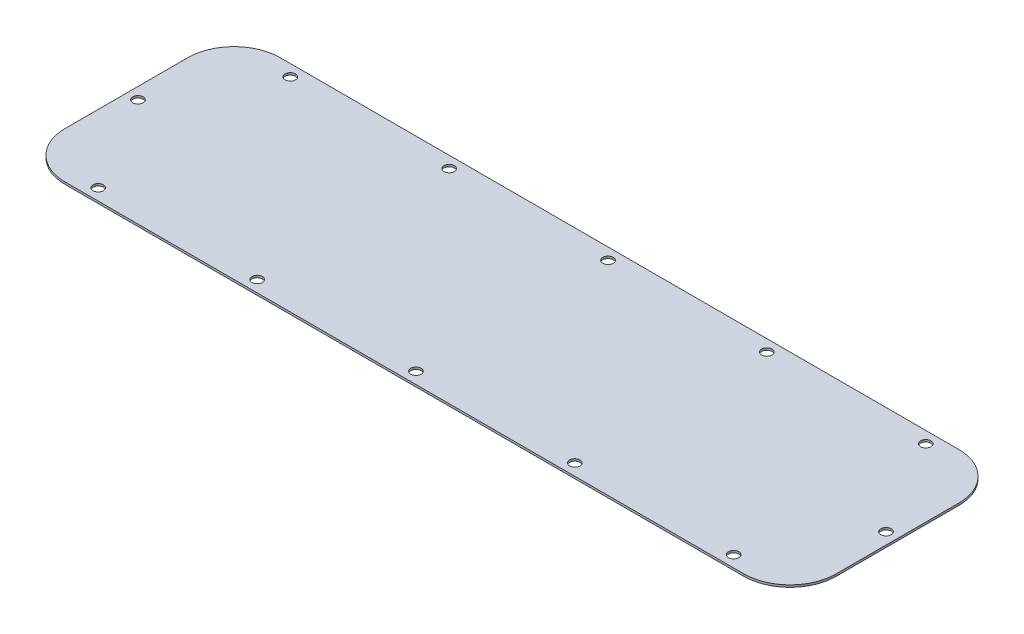
ISO-10303-21;
HEADER;
FILE_DESCRIPTION(('STEP AP214'),'2;1');
FILE_NAME('part.step','',(''),(''),'','','');
FILE_SCHEMA(('AUTOMOTIVE_DESIGN { 1 0 10303 214 1 1 1 1 }'));
ENDSEC;
DATA;
#1=APPLICATION_CONTEXT('core data for automotive mechanical design processes');
#2=APPLICATION_PROTOCOL_DEFINITION('international standard','automotive_design',2000,#1);
#3=PRODUCT_CONTEXT('',#1,'mechanical');
#4=PRODUCT('Part','Part','',(#3));
#5=PRODUCT_RELATED_PRODUCT_CATEGORY('part','',(#4));
#6=PRODUCT_DEFINITION_FORMATION('','',#4);
#7=PRODUCT_DEFINITION_CONTEXT('part definition',#1,'design');
#8=PRODUCT_DEFINITION('design','',#6,#7);
#9=PRODUCT_DEFINITION_SHAPE('','',#8);
#10=(LENGTH_UNIT() NAMED_UNIT(*) SI_UNIT(.MILLI.,.METRE.));
#11=(NAMED_UNIT(*) PLANE_ANGLE_UNIT() SI_UNIT($,.RADIAN.));
#12=(NAMED_UNIT(*) SI_UNIT($,.STERADIAN.) SOLID_ANGLE_UNIT());
#13=UNCERTAINTY_MEASURE_WITH_UNIT(LENGTH_MEASURE(1.E-05),#10,'distance_accuracy_value','');
#14=(GEOMETRIC_REPRESENTATION_CONTEXT(3) GLOBAL_UNCERTAINTY_ASSIGNED_CONTEXT((#13)) GLOBAL_UNIT_ASSIGNED_CONTEXT((#10,
#11,#12)) REPRESENTATION_CONTEXT('',''));
#15=CARTESIAN_POINT('',(0.,0.,0.));
#16=DIRECTION('',(0.,0.,1.));
#17=DIRECTION('',(1.,0.,0.));
#18=AXIS2_PLACEMENT_3D('',#15,#16,#17);
#19=CARTESIAN_POINT('',(-267.,1.5,-42.5));
#20=DIRECTION('',(1.,0.,0.));
#21=DIRECTION('',(0.,0.,-1.));
#22=AXIS2_PLACEMENT_3D('',#19,#20,#21);
#23=PLANE('',#22);
#24=DIRECTION('',(0.,0.,1.));
#25=VECTOR('',#24,1.);
#26=CARTESIAN_POINT('',(-267.,0.,-42.5));
#27=LINE('',#26,#25);
#28=CARTESIAN_POINT('',(-267.,0.,-42.5));
#29=VERTEX_POINT('',#28);
#30=CARTESIAN_POINT('',(-267.,0.,42.5));
#31=VERTEX_POINT('',#30);
#32=EDGE_CURVE('E11',#29,#31,#27,.T.);
#33=ORIENTED_EDGE('',*,*,#32,.T.);
#34=DIRECTION('',(0.,-1.,0.));
#35=VECTOR('',#34,1.);
#36=CARTESIAN_POINT('',(-267.,1.5,42.5));
#37=LINE('',#36,#35);
#38=CARTESIAN_POINT('',(-267.,1.5,42.5));
#39=VERTEX_POINT('',#38);
#40=EDGE_CURVE('E25',#39,#31,#37,.T.);
#41=ORIENTED_EDGE('',*,*,#40,.F.);
#42=DIRECTION('',(0.,0.,1.));
#43=VECTOR('',#42,1.);
#44=CARTESIAN_POINT('',(-267.,1.5,-42.5));
#45=LINE('',#44,#43);
#46=CARTESIAN_POINT('',(-267.,1.5,-42.5));
#47=VERTEX_POINT('',#46);
#48=EDGE_CURVE('E565',#47,#39,#45,.T.);
#49=ORIENTED_EDGE('',*,*,#48,.F.);
#50=DIRECTION('',(0.,-1.,0.));
#51=VECTOR('',#50,1.);
#52=CARTESIAN_POINT('',(-267.,1.5,-42.5));
#53=LINE('',#52,#51);
#54=EDGE_CURVE('E561',#47,#29,#53,.T.);
#55=ORIENTED_EDGE('',*,*,#54,.T.);
#56=EDGE_LOOP('',(#33,#41,#49,#55));
#57=FACE_BOUND('',#56,.T.);
#58=ADVANCED_FACE('F17',(#57),#23,.F.);
#59=CARTESIAN_POINT('',(-235.,1.5,-42.5000000000016));
#60=DIRECTION('',(0.,-1.,0.));
#61=DIRECTION('',(0.707106781186565,0.,0.70710678118653));
#62=AXIS2_PLACEMENT_3D('',#59,#60,#61);
#63=CYLINDRICAL_SURFACE('',#62,31.9999999999984);
#64=CARTESIAN_POINT('',(-235.,0.,-42.5000000000016));
#65=DIRECTION('',(0.,1.,0.));
#66=DIRECTION('',(1.,0.,0.));
#67=AXIS2_PLACEMENT_3D('',#64,#65,#66);
#68=CIRCLE('',#67,31.9999999999984);
#69=CARTESIAN_POINT('',(-235.,0.,-74.5));
#70=VERTEX_POINT('',#69);
#71=EDGE_CURVE('E556',#70,#29,#68,.T.);
#72=ORIENTED_EDGE('',*,*,#71,.T.);
#73=ORIENTED_EDGE('',*,*,#54,.F.);
#74=CARTESIAN_POINT('',(-235.,1.5,-42.5000000000016));
#75=DIRECTION('',(0.,1.,0.));
#76=DIRECTION('',(1.,0.,0.));
#77=AXIS2_PLACEMENT_3D('',#74,#75,#76);
#78=CIRCLE('',#77,31.9999999999984);
#79=CARTESIAN_POINT('',(-235.,1.5,-74.5));
#80=VERTEX_POINT('',#79);
#81=EDGE_CURVE('E551',#80,#47,#78,.T.);
#82=ORIENTED_EDGE('',*,*,#81,.F.);
#83=DIRECTION('',(0.,-1.,0.));
#84=VECTOR('',#83,1.);
#85=CARTESIAN_POINT('',(-235.,1.5,-74.5));
#86=LINE('',#85,#84);
#87=EDGE_CURVE('E547',#80,#70,#86,.T.);
#88=ORIENTED_EDGE('',*,*,#87,.T.);
#89=EDGE_LOOP('',(#72,#73,#82,#88));
#90=FACE_BOUND('',#89,.T.);
#91=ADVANCED_FACE('F583',(#90),#63,.T.);
#92=CARTESIAN_POINT('',(235.,1.5,-74.5));
#93=DIRECTION('',(0.,0.,1.));
#94=DIRECTION('',(1.,0.,0.));
#95=AXIS2_PLACEMENT_3D('',#92,#93,#94);
#96=PLANE('',#95);
#97=DIRECTION('',(-1.,0.,0.));
#98=VECTOR('',#97,1.);
#99=CARTESIAN_POINT('',(235.,0.,-74.5));
#100=LINE('',#99,#98);
#101=CARTESIAN_POINT('',(235.,0.,-74.5));
#102=VERTEX_POINT('',#101);
#103=EDGE_CURVE('E542',#102,#70,#100,.T.);
#104=ORIENTED_EDGE('',*,*,#103,.T.);
#105=ORIENTED_EDGE('',*,*,#87,.F.);
#106=DIRECTION('',(-1.,0.,0.));
#107=VECTOR('',#106,1.);
#108=CARTESIAN_POINT('',(235.,1.5,-74.5));
#109=LINE('',#108,#107);
#110=CARTESIAN_POINT('',(235.,1.5,-74.5));
#111=VERTEX_POINT('',#110);
#112=EDGE_CURVE('E537',#111,#80,#109,.T.);
#113=ORIENTED_EDGE('',*,*,#112,.F.);
#114=DIRECTION('',(0.,-1.,0.));
#115=VECTOR('',#114,1.);
#116=CARTESIAN_POINT('',(235.,1.5,-74.5));
#117=LINE('',#116,#115);
#118=EDGE_CURVE('E533',#111,#102,#117,.T.);
#119=ORIENTED_EDGE('',*,*,#118,.T.);
#120=EDGE_LOOP('',(#104,#105,#113,#119));
#121=FACE_BOUND('',#120,.T.);
#122=ADVANCED_FACE('F603',(#121),#96,.F.);
#123=CARTESIAN_POINT('',(235.,1.5,-42.5000000000016));
#124=DIRECTION('',(0.,-1.,0.));
#125=DIRECTION('',(-0.707106781186565,0.,0.70710678118653));
#126=AXIS2_PLACEMENT_3D('',#123,#124,#125);
#127=CYLINDRICAL_SURFACE('',#126,31.9999999999984);
#128=CARTESIAN_POINT('',(235.,0.,-42.5000000000016));
#129=DIRECTION('',(0.,1.,0.));
#130=DIRECTION('',(1.,0.,0.));
#131=AXIS2_PLACEMENT_3D('',#128,#129,#130);
#132=CIRCLE('',#131,31.9999999999984);
#133=CARTESIAN_POINT('',(267.,0.,-42.5));
#134=VERTEX_POINT('',#133);
#135=EDGE_CURVE('E528',#134,#102,#132,.T.);
#136=ORIENTED_EDGE('',*,*,#135,.T.);
#137=ORIENTED_EDGE('',*,*,#118,.F.);
#138=CARTESIAN_POINT('',(235.,1.5,-42.5000000000016));
#139=DIRECTION('',(0.,1.,0.));
#140=DIRECTION('',(1.,0.,0.));
#141=AXIS2_PLACEMENT_3D('',#138,#139,#140);
#142=CIRCLE('',#141,31.9999999999984);
#143=CARTESIAN_POINT('',(267.,1.5,-42.5));
#144=VERTEX_POINT('',#143);
#145=EDGE_CURVE('E523',#144,#111,#142,.T.);
#146=ORIENTED_EDGE('',*,*,#145,.F.);
#147=DIRECTION('',(0.,-1.,0.));
#148=VECTOR('',#147,1.);
#149=CARTESIAN_POINT('',(267.,1.5,-42.5));
#150=LINE('',#149,#148);
#151=EDGE_CURVE('E519',#144,#134,#150,.T.);
#152=ORIENTED_EDGE('',*,*,#151,.T.);
#153=EDGE_LOOP('',(#136,#137,#146,#152));
#154=FACE_BOUND('',#153,.T.);
#155=ADVANCED_FACE('F600',(#154),#127,.T.);
#156=CARTESIAN_POINT('',(267.,1.5,42.5));
#157=DIRECTION('',(-1.,0.,0.));
#158=DIRECTION('',(0.,0.,1.));
#159=AXIS2_PLACEMENT_3D('',#156,#157,#158);
#160=PLANE('',#159);
#161=DIRECTION('',(0.,0.,-1.));
#162=VECTOR('',#161,1.);
#163=CARTESIAN_POINT('',(267.,0.,42.5));
#164=LINE('',#163,#162);
#165=CARTESIAN_POINT('',(267.,0.,42.5));
#166=VERTEX_POINT('',#165);
#167=EDGE_CURVE('E514',#166,#134,#164,.T.);
#168=ORIENTED_EDGE('',*,*,#167,.T.);
#169=ORIENTED_EDGE('',*,*,#151,.F.);
#170=DIRECTION('',(0.,0.,-1.));
#171=VECTOR('',#170,1.);
#172=CARTESIAN_POINT('',(267.,1.5,42.5));
#173=LINE('',#172,#171);
#174=CARTESIAN_POINT('',(267.,1.5,42.5));
#175=VERTEX_POINT('',#174);
#176=EDGE_CURVE('E509',#175,#144,#173,.T.);
#177=ORIENTED_EDGE('',*,*,#176,.F.);
#178=DIRECTION('',(0.,-1.,0.));
#179=VECTOR('',#178,1.);
#180=CARTESIAN_POINT('',(267.,1.5,42.5));
#181=LINE('',#180,#179);
#182=EDGE_CURVE('E505',#175,#166,#181,.T.);
#183=ORIENTED_EDGE('',*,*,#182,.T.);
#184=EDGE_LOOP('',(#168,#169,#177,#183));
#185=FACE_BOUND('',#184,.T.);
#186=ADVANCED_FACE('F596',(#185),#160,.F.);
#187=CARTESIAN_POINT('',(235.,1.5,42.5000000000016));
#188=DIRECTION('',(0.,-1.,0.));
#189=DIRECTION('',(-0.707106781186565,0.,-0.70710678118653));
#190=AXIS2_PLACEMENT_3D('',#187,#188,#189);
#191=CYLINDRICAL_SURFACE('',#190,31.9999999999984);
#192=CARTESIAN_POINT('',(235.,0.,42.5000000000016));
#193=DIRECTION('',(0.,1.,0.));
#194=DIRECTION('',(1.,0.,0.));
#195=AXIS2_PLACEMENT_3D('',#192,#193,#194);
#196=CIRCLE('',#195,31.9999999999984);
#197=CARTESIAN_POINT('',(235.,0.,74.5));
#198=VERTEX_POINT('',#197);
#199=EDGE_CURVE('E500',#198,#166,#196,.T.);
#200=ORIENTED_EDGE('',*,*,#199,.T.);
#201=ORIENTED_EDGE('',*,*,#182,.F.);
#202=CARTESIAN_POINT('',(235.,1.5,42.5000000000016));
#203=DIRECTION('',(0.,1.,0.));
#204=DIRECTION('',(1.,0.,0.));
#205=AXIS2_PLACEMENT_3D('',#202,#203,#204);
#206=CIRCLE('',#205,31.9999999999984);
#207=CARTESIAN_POINT('',(235.,1.5,74.5));
#208=VERTEX_POINT('',#207);
#209=EDGE_CURVE('E495',#208,#175,#206,.T.);
#210=ORIENTED_EDGE('',*,*,#209,.F.);
#211=DIRECTION('',(0.,-1.,0.));
#212=VECTOR('',#211,1.);
#213=CARTESIAN_POINT('',(235.,1.5,74.5));
#214=LINE('',#213,#212);
#215=EDGE_CURVE('E491',#208,#198,#214,.T.);
#216=ORIENTED_EDGE('',*,*,#215,.T.);
#217=EDGE_LOOP('',(#200,#201,#210,#216));
#218=FACE_BOUND('',#217,.T.);
#219=ADVANCED_FACE('F594',(#218),#191,.T.);
#220=CARTESIAN_POINT('',(-235.,1.5,74.5));
#221=DIRECTION('',(0.,0.,-1.));
#222=DIRECTION('',(-1.,0.,0.));
#223=AXIS2_PLACEMENT_3D('',#220,#221,#222);
#224=PLANE('',#223);
#225=DIRECTION('',(1.,0.,0.));
#226=VECTOR('',#225,1.);
#227=CARTESIAN_POINT('',(-235.,0.,74.5));
#228=LINE('',#227,#226);
#229=CARTESIAN_POINT('',(-235.,0.,74.5));
#230=VERTEX_POINT('',#229);
#231=EDGE_CURVE('E486',#230,#198,#228,.T.);
#232=ORIENTED_EDGE('',*,*,#231,.T.);
#233=ORIENTED_EDGE('',*,*,#215,.F.);
#234=DIRECTION('',(1.,0.,0.));
#235=VECTOR('',#234,1.);
#236=CARTESIAN_POINT('',(-235.,1.5,74.5));
#237=LINE('',#236,#235);
#238=CARTESIAN_POINT('',(-235.,1.5,74.5));
#239=VERTEX_POINT('',#238);
#240=EDGE_CURVE('E481',#239,#208,#237,.T.);
#241=ORIENTED_EDGE('',*,*,#240,.F.);
#242=DIRECTION('',(0.,-1.,0.));
#243=VECTOR('',#242,1.);
#244=CARTESIAN_POINT('',(-235.,1.5,74.5));
#245=LINE('',#244,#243);
#246=EDGE_CURVE('E477',#239,#230,#245,.T.);
#247=ORIENTED_EDGE('',*,*,#246,.T.);
#248=EDGE_LOOP('',(#232,#233,#241,#247));
#249=FACE_BOUND('',#248,.T.);
#250=ADVANCED_FACE('F591',(#249),#224,.F.);
#251=CARTESIAN_POINT('',(-235.,1.5,42.5000000000016));
#252=DIRECTION('',(0.,-1.,0.));
#253=DIRECTION('',(0.707106781186565,0.,-0.70710678118653));
#254=AXIS2_PLACEMENT_3D('',#251,#252,#253);
#255=CYLINDRICAL_SURFACE('',#254,31.9999999999984);
#256=CARTESIAN_POINT('',(-235.,0.,42.5000000000016));
#257=DIRECTION('',(0.,1.,0.));
#258=DIRECTION('',(1.,0.,0.));
#259=AXIS2_PLACEMENT_3D('',#256,#257,#258);
#260=CIRCLE('',#259,31.9999999999984);
#261=EDGE_CURVE('E472',#31,#230,#260,.T.);
#262=ORIENTED_EDGE('',*,*,#261,.T.);
#263=ORIENTED_EDGE('',*,*,#246,.F.);
#264=CARTESIAN_POINT('',(-235.,1.5,42.5000000000016));
#265=DIRECTION('',(0.,1.,0.));
#266=DIRECTION('',(1.,0.,0.));
#267=AXIS2_PLACEMENT_3D('',#264,#265,#266);
#268=CIRCLE('',#267,31.9999999999984);
#269=EDGE_CURVE('E467',#39,#239,#268,.T.);
#270=ORIENTED_EDGE('',*,*,#269,.F.);
#271=ORIENTED_EDGE('',*,*,#40,.T.);
#272=EDGE_LOOP('',(#262,#263,#270,#271));
#273=FACE_BOUND('',#272,.T.);
#274=ADVANCED_FACE('F575',(#273),#255,.T.);
#275=CARTESIAN_POINT('',(-235.,1.5,42.5000000000016));
#276=DIRECTION('',(0.,1.,0.));
#277=DIRECTION('',(0.,0.,1.));
#278=AXIS2_PLACEMENT_3D('',#275,#276,#277);
#279=PLANE('',#278);
#280=CARTESIAN_POINT('',(-259.,1.5,0.));
#281=DIRECTION('',(0.,1.,0.));
#282=DIRECTION('',(0.,0.,1.));
#283=AXIS2_PLACEMENT_3D('',#280,#281,#282);
#284=CIRCLE('',#283,3.6);
#285=CARTESIAN_POINT('',(-259.,1.5,3.6));
#286=VERTEX_POINT('',#285);
#287=CARTESIAN_POINT('',(-259.,1.5,-3.6));
#288=VERTEX_POINT('',#287);
#289=EDGE_CURVE('E462',#286,#288,#284,.T.);
#290=ORIENTED_EDGE('',*,*,#289,.F.);
#291=CARTESIAN_POINT('',(-259.,1.5,0.));
#292=DIRECTION('',(0.,1.,0.));
#293=DIRECTION('',(1.,0.,0.));
#294=AXIS2_PLACEMENT_3D('',#291,#292,#293);
#295=CIRCLE('',#294,3.6);
#296=EDGE_CURVE('E457',#288,#286,#295,.T.);
#297=ORIENTED_EDGE('',*,*,#296,.F.);
#298=EDGE_LOOP('',(#290,#297));
#299=FACE_BOUND('',#298,.T.);
#300=CARTESIAN_POINT('',(-220.,1.5,-66.5));
#301=DIRECTION('',(0.,1.,0.));
#302=DIRECTION('',(0.,0.,1.));
#303=AXIS2_PLACEMENT_3D('',#300,#301,#302);
#304=CIRCLE('',#303,3.6);
#305=CARTESIAN_POINT('',(-220.,1.5,-62.9));
#306=VERTEX_POINT('',#305);
#307=CARTESIAN_POINT('',(-220.,1.5,-70.1));
#308=VERTEX_POINT('',#307);
#309=EDGE_CURVE('E452',#306,#308,#304,.T.);
#310=ORIENTED_EDGE('',*,*,#309,.F.);
#311=CARTESIAN_POINT('',(-220.,1.5,-66.5));
#312=DIRECTION('',(0.,1.,0.));
#313=DIRECTION('',(1.,0.,0.));
#314=AXIS2_PLACEMENT_3D('',#311,#312,#313);
#315=CIRCLE('',#314,3.6);
#316=EDGE_CURVE('E447',#308,#306,#315,.T.);
#317=ORIENTED_EDGE('',*,*,#316,.F.);
#318=EDGE_LOOP('',(#310,#317));
#319=FACE_BOUND('',#318,.T.);
#320=CARTESIAN_POINT('',(-220.,1.5,66.5));
#321=DIRECTION('',(0.,1.,0.));
#322=DIRECTION('',(0.,0.,1.));
#323=AXIS2_PLACEMENT_3D('',#320,#321,#322);
#324=CIRCLE('',#323,3.59999999999999);
#325=CARTESIAN_POINT('',(-220.,1.5,70.1));
#326=VERTEX_POINT('',#325);
#327=CARTESIAN_POINT('',(-220.,1.5,62.9));
#328=VERTEX_POINT('',#327);
#329=EDGE_CURVE('E442',#326,#328,#324,.T.);
#330=ORIENTED_EDGE('',*,*,#329,.F.);
#331=CARTESIAN_POINT('',(-220.,1.5,66.5));
#332=DIRECTION('',(0.,1.,0.));
#333=DIRECTION('',(1.,0.,0.));
#334=AXIS2_PLACEMENT_3D('',#331,#332,#333);
#335=CIRCLE('',#334,3.6);
#336=EDGE_CURVE('E437',#328,#326,#335,.T.);
#337=ORIENTED_EDGE('',*,*,#336,.F.);
#338=EDGE_LOOP('',(#330,#337));
#339=FACE_BOUND('',#338,.T.);
#340=CARTESIAN_POINT('',(-110.,1.5,-66.5));
#341=DIRECTION('',(0.,1.,0.));
#342=DIRECTION('',(0.,0.,1.));
#343=AXIS2_PLACEMENT_3D('',#340,#341,#342);
#344=CIRCLE('',#343,3.6);
#345=CARTESIAN_POINT('',(-110.,1.5,-62.9));
#346=VERTEX_POINT('',#345);
#347=CARTESIAN_POINT('',(-110.,1.5,-70.1));
#348=VERTEX_POINT('',#347);
#349=EDGE_CURVE('E432',#346,#348,#344,.T.);
#350=ORIENTED_EDGE('',*,*,#349,.F.);
#351=CARTESIAN_POINT('',(-110.,1.5,-66.5));
#352=DIRECTION('',(0.,1.,0.));
#353=DIRECTION('',(1.,0.,0.));
#354=AXIS2_PLACEMENT_3D('',#351,#352,#353);
#355=CIRCLE('',#354,3.6);
#356=EDGE_CURVE('E427',#348,#346,#355,.T.);
#357=ORIENTED_EDGE('',*,*,#356,.F.);
#358=EDGE_LOOP('',(#350,#357));
#359=FACE_BOUND('',#358,.T.);
#360=CARTESIAN_POINT('',(-110.,1.5,66.5));
#361=DIRECTION('',(0.,1.,0.));
#362=DIRECTION('',(0.,0.,1.));
#363=AXIS2_PLACEMENT_3D('',#360,#361,#362);
#364=CIRCLE('',#363,3.59999999999999);
#365=CARTESIAN_POINT('',(-110.,1.5,70.1));
#366=VERTEX_POINT('',#365);
#367=CARTESIAN_POINT('',(-110.,1.5,62.9));
#368=VERTEX_POINT('',#367);
#369=EDGE_CURVE('E422',#366,#368,#364,.T.);
#370=ORIENTED_EDGE('',*,*,#369,.F.);
#371=CARTESIAN_POINT('',(-110.,1.5,66.5));
#372=DIRECTION('',(0.,1.,0.));
#373=DIRECTION('',(1.,0.,0.));
#374=AXIS2_PLACEMENT_3D('',#371,#372,#373);
#375=CIRCLE('',#374,3.6);
#376=EDGE_CURVE('E417',#368,#366,#375,.T.);
#377=ORIENTED_EDGE('',*,*,#376,.F.);
#378=EDGE_LOOP('',(#370,#377));
#379=FACE_BOUND('',#378,.T.);
#380=CARTESIAN_POINT('',(0.,1.5,-66.5));
#381=DIRECTION('',(0.,1.,0.));
#382=DIRECTION('',(0.,0.,1.));
#383=AXIS2_PLACEMENT_3D('',#380,#381,#382);
#384=CIRCLE('',#383,3.6);
#385=CARTESIAN_POINT('',(0.,1.5,-62.9));
#386=VERTEX_POINT('',#385);
#387=CARTESIAN_POINT('',(0.,1.5,-70.1));
#388=VERTEX_POINT('',#387);
#389=EDGE_CURVE('E412',#386,#388,#384,.T.);
#390=ORIENTED_EDGE('',*,*,#389,.F.);
#391=CARTESIAN_POINT('',(0.,1.5,-66.5));
#392=DIRECTION('',(0.,1.,0.));
#393=DIRECTION('',(1.,0.,0.));
#394=AXIS2_PLACEMENT_3D('',#391,#392,#393);
#395=CIRCLE('',#394,3.6);
#396=EDGE_CURVE('E407',#388,#386,#395,.T.);
#397=ORIENTED_EDGE('',*,*,#396,.F.);
#398=EDGE_LOOP('',(#390,#397));
#399=FACE_BOUND('',#398,.T.);
#400=CARTESIAN_POINT('',(0.,1.5,66.5));
#401=DIRECTION('',(0.,1.,0.));
#402=DIRECTION('',(0.,0.,1.));
#403=AXIS2_PLACEMENT_3D('',#400,#401,#402);
#404=CIRCLE('',#403,3.59999999999999);
#405=CARTESIAN_POINT('',(0.,1.5,70.1));
#406=VERTEX_POINT('',#405);
#407=CARTESIAN_POINT('',(0.,1.5,62.9));
#408=VERTEX_POINT('',#407);
#409=EDGE_CURVE('E402',#406,#408,#404,.T.);
#410=ORIENTED_EDGE('',*,*,#409,.F.);
#411=CARTESIAN_POINT('',(0.,1.5,66.5));
#412=DIRECTION('',(0.,1.,0.));
#413=DIRECTION('',(1.,0.,0.));
#414=AXIS2_PLACEMENT_3D('',#411,#412,#413);
#415=CIRCLE('',#414,3.6);
#416=EDGE_CURVE('E397',#408,#406,#415,.T.);
#417=ORIENTED_EDGE('',*,*,#416,.F.);
#418=EDGE_LOOP('',(#410,#417));
#419=FACE_BOUND('',#418,.T.);
#420=CARTESIAN_POINT('',(110.,1.5,-66.5));
#421=DIRECTION('',(0.,1.,0.));
#422=DIRECTION('',(0.,0.,1.));
#423=AXIS2_PLACEMENT_3D('',#420,#421,#422);
#424=CIRCLE('',#423,3.6);
#425=CARTESIAN_POINT('',(110.,1.5,-62.9));
#426=VERTEX_POINT('',#425);
#427=CARTESIAN_POINT('',(110.,1.5,-70.1));
#428=VERTEX_POINT('',#427);
#429=EDGE_CURVE('E392',#426,#428,#424,.T.);
#430=ORIENTED_EDGE('',*,*,#429,.F.);
#431=CARTESIAN_POINT('',(110.,1.5,-66.5));
#432=DIRECTION('',(0.,1.,0.));
#433=DIRECTION('',(1.,0.,0.));
#434=AXIS2_PLACEMENT_3D('',#431,#432,#433);
#435=CIRCLE('',#434,3.6);
#436=EDGE_CURVE('E387',#428,#426,#435,.T.);
#437=ORIENTED_EDGE('',*,*,#436,.F.);
#438=EDGE_LOOP('',(#430,#437));
#439=FACE_BOUND('',#438,.T.);
#440=CARTESIAN_POINT('',(110.,1.5,66.5));
#441=DIRECTION('',(0.,1.,0.));
#442=DIRECTION('',(0.,0.,1.));
#443=AXIS2_PLACEMENT_3D('',#440,#441,#442);
#444=CIRCLE('',#443,3.59999999999999);
#445=CARTESIAN_POINT('',(110.,1.5,70.1));
#446=VERTEX_POINT('',#445);
#447=CARTESIAN_POINT('',(110.,1.5,62.9));
#448=VERTEX_POINT('',#447);
#449=EDGE_CURVE('E382',#446,#448,#444,.T.);
#450=ORIENTED_EDGE('',*,*,#449,.F.);
#451=CARTESIAN_POINT('',(110.,1.5,66.5));
#452=DIRECTION('',(0.,1.,0.));
#453=DIRECTION('',(1.,0.,0.));
#454=AXIS2_PLACEMENT_3D('',#451,#452,#453);
#455=CIRCLE('',#454,3.6);
#456=EDGE_CURVE('E377',#448,#446,#455,.T.);
#457=ORIENTED_EDGE('',*,*,#456,.F.);
#458=EDGE_LOOP('',(#450,#457));
#459=FACE_BOUND('',#458,.T.);
#460=CARTESIAN_POINT('',(220.,1.5,-66.5));
#461=DIRECTION('',(0.,1.,0.));
#462=DIRECTION('',(0.,0.,1.));
#463=AXIS2_PLACEMENT_3D('',#460,#461,#462);
#464=CIRCLE('',#463,3.6);
#465=CARTESIAN_POINT('',(220.,1.5,-62.9));
#466=VERTEX_POINT('',#465);
#467=CARTESIAN_POINT('',(220.,1.5,-70.1));
#468=VERTEX_POINT('',#467);
#469=EDGE_CURVE('E372',#466,#468,#464,.T.);
#470=ORIENTED_EDGE('',*,*,#469,.F.);
#471=CARTESIAN_POINT('',(220.,1.5,-66.5));
#472=DIRECTION('',(0.,1.,0.));
#473=DIRECTION('',(1.,0.,0.));
#474=AXIS2_PLACEMENT_3D('',#471,#472,#473);
#475=CIRCLE('',#474,3.6);
#476=EDGE_CURVE('E367',#468,#466,#475,.T.);
#477=ORIENTED_EDGE('',*,*,#476,.F.);
#478=EDGE_LOOP('',(#470,#477));
#479=FACE_BOUND('',#478,.T.);
#480=CARTESIAN_POINT('',(220.,1.5,66.5));
#481=DIRECTION('',(0.,1.,0.));
#482=DIRECTION('',(0.,0.,1.));
#483=AXIS2_PLACEMENT_3D('',#480,#481,#482);
#484=CIRCLE('',#483,3.59999999999999);
#485=CARTESIAN_POINT('',(220.,1.5,70.1));
#486=VERTEX_POINT('',#485);
#487=CARTESIAN_POINT('',(220.,1.5,62.9));
#488=VERTEX_POINT('',#487);
#489=EDGE_CURVE('E363',#486,#488,#484,.T.);
#490=ORIENTED_EDGE('',*,*,#489,.F.);
#491=CARTESIAN_POINT('',(220.,1.5,66.5));
#492=DIRECTION('',(0.,1.,0.));
#493=DIRECTION('',(1.,0.,0.));
#494=AXIS2_PLACEMENT_3D('',#491,#492,#493);
#495=CIRCLE('',#494,3.6);
#496=EDGE_CURVE('E241',#488,#486,#495,.T.);
#497=ORIENTED_EDGE('',*,*,#496,.F.);
#498=EDGE_LOOP('',(#490,#497));
#499=FACE_BOUND('',#498,.T.);
#500=CARTESIAN_POINT('',(259.,1.5,0.));
#501=DIRECTION('',(0.,1.,0.));
#502=DIRECTION('',(0.,0.,1.));
#503=AXIS2_PLACEMENT_3D('',#500,#501,#502);
#504=CIRCLE('',#503,3.6);
#505=CARTESIAN_POINT('',(259.,1.5,3.6));
#506=VERTEX_POINT('',#505);
#507=CARTESIAN_POINT('',(259.,1.5,-3.6));
#508=VERTEX_POINT('',#507);
#509=EDGE_CURVE('E355',#506,#508,#504,.T.);
#510=ORIENTED_EDGE('',*,*,#509,.F.);
#511=CARTESIAN_POINT('',(259.,1.5,0.));
#512=DIRECTION('',(0.,1.,0.));
#513=DIRECTION('',(1.,0.,0.));
#514=AXIS2_PLACEMENT_3D('',#511,#512,#513);
#515=CIRCLE('',#514,3.6);
#516=EDGE_CURVE('E350',#508,#506,#515,.T.);
#517=ORIENTED_EDGE('',*,*,#516,.F.);
#518=EDGE_LOOP('',(#510,#517));
#519=FACE_BOUND('',#518,.T.);
#520=ORIENTED_EDGE('',*,*,#48,.T.);
#521=ORIENTED_EDGE('',*,*,#269,.T.);
#522=ORIENTED_EDGE('',*,*,#240,.T.);
#523=ORIENTED_EDGE('',*,*,#209,.T.);
#524=ORIENTED_EDGE('',*,*,#176,.T.);
#525=ORIENTED_EDGE('',*,*,#145,.T.);
#526=ORIENTED_EDGE('',*,*,#112,.T.);
#527=ORIENTED_EDGE('',*,*,#81,.T.);
#528=EDGE_LOOP('',(#520,#521,#522,#523,#524,#525,#526,#527));
#529=FACE_BOUND('',#528,.T.);
#530=ADVANCED_FACE('F579',(#299,#319,#339,#359,#379,#399,#419,#439,#459,#479,#499,#519,#529),
#279,.T.);
#531=CARTESIAN_POINT('',(259.,1.5,0.));
#532=DIRECTION('',(0.,-1.,0.));
#533=DIRECTION('',(1.,0.,0.));
#534=AXIS2_PLACEMENT_3D('',#531,#532,#533);
#535=CYLINDRICAL_SURFACE('',#534,3.6);
#536=DIRECTION('',(0.,-1.,0.));
#537=VECTOR('',#536,1.);
#538=CARTESIAN_POINT('',(259.,1.5,3.6));
#539=LINE('',#538,#537);
#540=CARTESIAN_POINT('',(259.,0.,3.6));
#541=VERTEX_POINT('',#540);
#542=EDGE_CURVE('E346',#506,#541,#539,.T.);
#543=ORIENTED_EDGE('',*,*,#542,.T.);
#544=CARTESIAN_POINT('',(259.,0.,0.));
#545=DIRECTION('',(0.,1.,0.));
#546=DIRECTION('',(1.,0.,0.));
#547=AXIS2_PLACEMENT_3D('',#544,#545,#546);
#548=CIRCLE('',#547,3.6);
#549=CARTESIAN_POINT('',(259.,0.,-3.6));
#550=VERTEX_POINT('',#549);
#551=EDGE_CURVE('E341',#550,#541,#548,.T.);
#552=ORIENTED_EDGE('',*,*,#551,.F.);
#553=DIRECTION('',(0.,-1.,0.));
#554=VECTOR('',#553,1.);
#555=CARTESIAN_POINT('',(259.,1.5,-3.6));
#556=LINE('',#555,#554);
#557=EDGE_CURVE('E336',#508,#550,#556,.T.);
#558=ORIENTED_EDGE('',*,*,#557,.F.);
#559=ORIENTED_EDGE('',*,*,#516,.T.);
#560=EDGE_LOOP('',(#543,#552,#558,#559));
#561=FACE_BOUND('',#560,.T.);
#562=ADVANCED_FACE('F682',(#561),#535,.F.);
#563=CARTESIAN_POINT('',(259.,1.5,0.));
#564=DIRECTION('',(0.,-1.,0.));
#565=DIRECTION('',(-1.,0.,0.));
#566=AXIS2_PLACEMENT_3D('',#563,#564,#565);
#567=CYLINDRICAL_SURFACE('',#566,3.6);
#568=ORIENTED_EDGE('',*,*,#542,.F.);
#569=ORIENTED_EDGE('',*,*,#509,.T.);
#570=ORIENTED_EDGE('',*,*,#557,.T.);
#571=CARTESIAN_POINT('',(259.,0.,0.));
#572=DIRECTION('',(0.,1.,0.));
#573=DIRECTION('',(0.,0.,1.));
#574=AXIS2_PLACEMENT_3D('',#571,#572,#573);
#575=CIRCLE('',#574,3.6);
#576=EDGE_CURVE('E331',#541,#550,#575,.T.);
#577=ORIENTED_EDGE('',*,*,#576,.F.);
#578=EDGE_LOOP('',(#568,#569,#570,#577));
#579=FACE_BOUND('',#578,.T.);
#580=ADVANCED_FACE('F693',(#579),#567,.F.);
#581=CARTESIAN_POINT('',(-235.,0.,42.5000000000016));
#582=DIRECTION('',(0.,1.,0.));
#583=DIRECTION('',(0.,0.,1.));
#584=AXIS2_PLACEMENT_3D('',#581,#582,#583);
#585=PLANE('',#584);
#586=CARTESIAN_POINT('',(-259.,0.,0.));
#587=DIRECTION('',(0.,1.,0.));
#588=DIRECTION('',(0.,0.,1.));
#589=AXIS2_PLACEMENT_3D('',#586,#587,#588);
#590=CIRCLE('',#589,3.6);
#591=CARTESIAN_POINT('',(-259.,0.,3.6));
#592=VERTEX_POINT('',#591);
#593=CARTESIAN_POINT('',(-259.,0.,-3.6));
#594=VERTEX_POINT('',#593);
#595=EDGE_CURVE('E327',#592,#594,#590,.T.);
#596=ORIENTED_EDGE('',*,*,#595,.T.);
#597=CARTESIAN_POINT('',(-259.,0.,0.));
#598=DIRECTION('',(0.,1.,0.));
#599=DIRECTION('',(1.,0.,0.));
#600=AXIS2_PLACEMENT_3D('',#597,#598,#599);
#601=CIRCLE('',#600,3.6);
#602=EDGE_CURVE('E323',#594,#592,#601,.T.);
#603=ORIENTED_EDGE('',*,*,#602,.T.);
#604=EDGE_LOOP('',(#596,#603));
#605=FACE_BOUND('',#604,.T.);
#606=CARTESIAN_POINT('',(-220.,0.,-66.5));
#607=DIRECTION('',(0.,1.,0.));
#608=DIRECTION('',(0.,0.,1.));
#609=AXIS2_PLACEMENT_3D('',#606,#607,#608);
#610=CIRCLE('',#609,3.6);
#611=CARTESIAN_POINT('',(-220.,0.,-62.9));
#612=VERTEX_POINT('',#611);
#613=CARTESIAN_POINT('',(-220.,0.,-70.1));
#614=VERTEX_POINT('',#613);
#615=EDGE_CURVE('E319',#612,#614,#610,.T.);
#616=ORIENTED_EDGE('',*,*,#615,.T.);
#617=CARTESIAN_POINT('',(-220.,0.,-66.5));
#618=DIRECTION('',(0.,1.,0.));
#619=DIRECTION('',(1.,0.,0.));
#620=AXIS2_PLACEMENT_3D('',#617,#618,#619);
#621=CIRCLE('',#620,3.6);
#622=EDGE_CURVE('E315',#614,#612,#621,.T.);
#623=ORIENTED_EDGE('',*,*,#622,.T.);
#624=EDGE_LOOP('',(#616,#623));
#625=FACE_BOUND('',#624,.T.);
#626=CARTESIAN_POINT('',(-220.,0.,66.5));
#627=DIRECTION('',(0.,1.,0.));
#628=DIRECTION('',(0.,0.,1.));
#629=AXIS2_PLACEMENT_3D('',#626,#627,#628);
#630=CIRCLE('',#629,3.59999999999999);
#631=CARTESIAN_POINT('',(-220.,0.,70.1));
#632=VERTEX_POINT('',#631);
#633=CARTESIAN_POINT('',(-220.,0.,62.9));
#634=VERTEX_POINT('',#633);
#635=EDGE_CURVE('E311',#632,#634,#630,.T.);
#636=ORIENTED_EDGE('',*,*,#635,.T.);
#637=CARTESIAN_POINT('',(-220.,0.,66.5));
#638=DIRECTION('',(0.,1.,0.));
#639=DIRECTION('',(1.,0.,0.));
#640=AXIS2_PLACEMENT_3D('',#637,#638,#639);
#641=CIRCLE('',#640,3.6);
#642=EDGE_CURVE('E307',#634,#632,#641,.T.);
#643=ORIENTED_EDGE('',*,*,#642,.T.);
#644=EDGE_LOOP('',(#636,#643));
#645=FACE_BOUND('',#644,.T.);
#646=CARTESIAN_POINT('',(-110.,0.,-66.5));
#647=DIRECTION('',(0.,1.,0.));
#648=DIRECTION('',(0.,0.,1.));
#649=AXIS2_PLACEMENT_3D('',#646,#647,#648);
#650=CIRCLE('',#649,3.6);
#651=CARTESIAN_POINT('',(-110.,0.,-62.9));
#652=VERTEX_POINT('',#651);
#653=CARTESIAN_POINT('',(-110.,0.,-70.1));
#654=VERTEX_POINT('',#653);
#655=EDGE_CURVE('E303',#652,#654,#650,.T.);
#656=ORIENTED_EDGE('',*,*,#655,.T.);
#657=CARTESIAN_POINT('',(-110.,0.,-66.5));
#658=DIRECTION('',(0.,1.,0.));
#659=DIRECTION('',(1.,0.,0.));
#660=AXIS2_PLACEMENT_3D('',#657,#658,#659);
#661=CIRCLE('',#660,3.6);
#662=EDGE_CURVE('E299',#654,#652,#661,.T.);
#663=ORIENTED_EDGE('',*,*,#662,.T.);
#664=EDGE_LOOP('',(#656,#663));
#665=FACE_BOUND('',#664,.T.);
#666=CARTESIAN_POINT('',(-110.,0.,66.5));
#667=DIRECTION('',(0.,1.,0.));
#668=DIRECTION('',(0.,0.,1.));
#669=AXIS2_PLACEMENT_3D('',#666,#667,#668);
#670=CIRCLE('',#669,3.59999999999999);
#671=CARTESIAN_POINT('',(-110.,0.,70.1));
#672=VERTEX_POINT('',#671);
#673=CARTESIAN_POINT('',(-110.,0.,62.9));
#674=VERTEX_POINT('',#673);
#675=EDGE_CURVE('E295',#672,#674,#670,.T.);
#676=ORIENTED_EDGE('',*,*,#675,.T.);
#677=CARTESIAN_POINT('',(-110.,0.,66.5));
#678=DIRECTION('',(0.,1.,0.));
#679=DIRECTION('',(1.,0.,0.));
#680=AXIS2_PLACEMENT_3D('',#677,#678,#679);
#681=CIRCLE('',#680,3.6);
#682=EDGE_CURVE('E291',#674,#672,#681,.T.);
#683=ORIENTED_EDGE('',*,*,#682,.T.);
#684=EDGE_LOOP('',(#676,#683));
#685=FACE_BOUND('',#684,.T.);
#686=CARTESIAN_POINT('',(0.,0.,-66.5));
#687=DIRECTION('',(0.,1.,0.));
#688=DIRECTION('',(0.,0.,1.));
#689=AXIS2_PLACEMENT_3D('',#686,#687,#688);
#690=CIRCLE('',#689,3.6);
#691=CARTESIAN_POINT('',(0.,0.,-62.9));
#692=VERTEX_POINT('',#691);
#693=CARTESIAN_POINT('',(0.,0.,-70.1));
#694=VERTEX_POINT('',#693);
#695=EDGE_CURVE('E287',#692,#694,#690,.T.);
#696=ORIENTED_EDGE('',*,*,#695,.T.);
#697=CARTESIAN_POINT('',(0.,0.,-66.5));
#698=DIRECTION('',(0.,1.,0.));
#699=DIRECTION('',(1.,0.,0.));
#700=AXIS2_PLACEMENT_3D('',#697,#698,#699);
#701=CIRCLE('',#700,3.6);
#702=EDGE_CURVE('E283',#694,#692,#701,.T.);
#703=ORIENTED_EDGE('',*,*,#702,.T.);
#704=EDGE_LOOP('',(#696,#703));
#705=FACE_BOUND('',#704,.T.);
#706=CARTESIAN_POINT('',(0.,0.,66.5));
#707=DIRECTION('',(0.,1.,0.));
#708=DIRECTION('',(0.,0.,1.));
#709=AXIS2_PLACEMENT_3D('',#706,#707,#708);
#710=CIRCLE('',#709,3.59999999999999);
#711=CARTESIAN_POINT('',(0.,0.,70.1));
#712=VERTEX_POINT('',#711);
#713=CARTESIAN_POINT('',(0.,0.,62.9));
#714=VERTEX_POINT('',#713);
#715=EDGE_CURVE('E279',#712,#714,#710,.T.);
#716=ORIENTED_EDGE('',*,*,#715,.T.);
#717=CARTESIAN_POINT('',(0.,0.,66.5));
#718=DIRECTION('',(0.,1.,0.));
#719=DIRECTION('',(1.,0.,0.));
#720=AXIS2_PLACEMENT_3D('',#717,#718,#719);
#721=CIRCLE('',#720,3.6);
#722=EDGE_CURVE('E275',#714,#712,#721,.T.);
#723=ORIENTED_EDGE('',*,*,#722,.T.);
#724=EDGE_LOOP('',(#716,#723));
#725=FACE_BOUND('',#724,.T.);
#726=CARTESIAN_POINT('',(110.,0.,-66.5));
#727=DIRECTION('',(0.,1.,0.));
#728=DIRECTION('',(0.,0.,1.));
#729=AXIS2_PLACEMENT_3D('',#726,#727,#728);
#730=CIRCLE('',#729,3.6);
#731=CARTESIAN_POINT('',(110.,0.,-62.9));
#732=VERTEX_POINT('',#731);
#733=CARTESIAN_POINT('',(110.,0.,-70.1));
#734=VERTEX_POINT('',#733);
#735=EDGE_CURVE('E271',#732,#734,#730,.T.);
#736=ORIENTED_EDGE('',*,*,#735,.T.);
#737=CARTESIAN_POINT('',(110.,0.,-66.5));
#738=DIRECTION('',(0.,1.,0.));
#739=DIRECTION('',(1.,0.,0.));
#740=AXIS2_PLACEMENT_3D('',#737,#738,#739);
#741=CIRCLE('',#740,3.6);
#742=EDGE_CURVE('E267',#734,#732,#741,.T.);
#743=ORIENTED_EDGE('',*,*,#742,.T.);
#744=EDGE_LOOP('',(#736,#743));
#745=FACE_BOUND('',#744,.T.);
#746=CARTESIAN_POINT('',(110.,0.,66.5));
#747=DIRECTION('',(0.,1.,0.));
#748=DIRECTION('',(0.,0.,1.));
#749=AXIS2_PLACEMENT_3D('',#746,#747,#748);
#750=CIRCLE('',#749,3.59999999999999);
#751=CARTESIAN_POINT('',(110.,0.,70.1));
#752=VERTEX_POINT('',#751);
#753=CARTESIAN_POINT('',(110.,0.,62.9));
#754=VERTEX_POINT('',#753);
#755=EDGE_CURVE('E263',#752,#754,#750,.T.);
#756=ORIENTED_EDGE('',*,*,#755,.T.);
#757=CARTESIAN_POINT('',(110.,0.,66.5));
#758=DIRECTION('',(0.,1.,0.));
#759=DIRECTION('',(1.,0.,0.));
#760=AXIS2_PLACEMENT_3D('',#757,#758,#759);
#761=CIRCLE('',#760,3.6);
#762=EDGE_CURVE('E259',#754,#752,#761,.T.);
#763=ORIENTED_EDGE('',*,*,#762,.T.);
#764=EDGE_LOOP('',(#756,#763));
#765=FACE_BOUND('',#764,.T.);
#766=CARTESIAN_POINT('',(220.,0.,-66.5));
#767=DIRECTION('',(0.,1.,0.));
#768=DIRECTION('',(0.,0.,1.));
#769=AXIS2_PLACEMENT_3D('',#766,#767,#768);
#770=CIRCLE('',#769,3.6);
#771=CARTESIAN_POINT('',(220.,0.,-62.9));
#772=VERTEX_POINT('',#771);
#773=CARTESIAN_POINT('',(220.,0.,-70.1));
#774=VERTEX_POINT('',#773);
#775=EDGE_CURVE('E255',#772,#774,#770,.T.);
#776=ORIENTED_EDGE('',*,*,#775,.T.);
#777=CARTESIAN_POINT('',(220.,0.,-66.5));
#778=DIRECTION('',(0.,1.,0.));
#779=DIRECTION('',(1.,0.,0.));
#780=AXIS2_PLACEMENT_3D('',#777,#778,#779);
#781=CIRCLE('',#780,3.6);
#782=EDGE_CURVE('E238',#774,#772,#781,.T.);
#783=ORIENTED_EDGE('',*,*,#782,.T.);
#784=EDGE_LOOP('',(#776,#783));
#785=FACE_BOUND('',#784,.T.);
#786=CARTESIAN_POINT('',(220.,0.,66.5));
#787=DIRECTION('',(0.,1.,0.));
#788=DIRECTION('',(0.,0.,1.));
#789=AXIS2_PLACEMENT_3D('',#786,#787,#788);
#790=CIRCLE('',#789,3.59999999999999);
#791=CARTESIAN_POINT('',(220.,0.,70.1));
#792=VERTEX_POINT('',#791);
#793=CARTESIAN_POINT('',(220.,0.,62.9));
#794=VERTEX_POINT('',#793);
#795=EDGE_CURVE('E225',#792,#794,#790,.T.);
#796=ORIENTED_EDGE('',*,*,#795,.T.);
#797=CARTESIAN_POINT('',(220.,0.,66.5));
#798=DIRECTION('',(0.,1.,0.));
#799=DIRECTION('',(1.,0.,0.));
#800=AXIS2_PLACEMENT_3D('',#797,#798,#799);
#801=CIRCLE('',#800,3.6);
#802=EDGE_CURVE('E221',#794,#792,#801,.T.);
#803=ORIENTED_EDGE('',*,*,#802,.T.);
#804=EDGE_LOOP('',(#796,#803));
#805=FACE_BOUND('',#804,.T.);
#806=ORIENTED_EDGE('',*,*,#576,.T.);
#807=ORIENTED_EDGE('',*,*,#551,.T.);
#808=EDGE_LOOP('',(#806,#807));
#809=FACE_BOUND('',#808,.T.);
#810=ORIENTED_EDGE('',*,*,#32,.F.);
#811=ORIENTED_EDGE('',*,*,#71,.F.);
#812=ORIENTED_EDGE('',*,*,#103,.F.);
#813=ORIENTED_EDGE('',*,*,#135,.F.);
#814=ORIENTED_EDGE('',*,*,#167,.F.);
#815=ORIENTED_EDGE('',*,*,#199,.F.);
#816=ORIENTED_EDGE('',*,*,#231,.F.);
#817=ORIENTED_EDGE('',*,*,#261,.F.);
#818=EDGE_LOOP('',(#810,#811,#812,#813,#814,#815,#816,#817));
#819=FACE_BOUND('',#818,.T.);
#820=ADVANCED_FACE('F223',(#605,#625,#645,#665,#685,#705,#725,#745,#765,#785,#805,#809,#819),
#585,.F.);
#821=CARTESIAN_POINT('',(220.,1.5,66.5));
#822=DIRECTION('',(0.,-1.,0.));
#823=DIRECTION('',(1.,0.,0.));
#824=AXIS2_PLACEMENT_3D('',#821,#822,#823);
#825=CYLINDRICAL_SURFACE('',#824,3.6);
#826=DIRECTION('',(0.,-1.,0.));
#827=VECTOR('',#826,1.);
#828=CARTESIAN_POINT('',(220.,1.5,70.1));
#829=LINE('',#828,#827);
#830=EDGE_CURVE('E230',#486,#792,#829,.T.);
#831=ORIENTED_EDGE('',*,*,#830,.T.);
#832=ORIENTED_EDGE('',*,*,#802,.F.);
#833=DIRECTION('',(0.,-1.,0.));
#834=VECTOR('',#833,1.);
#835=CARTESIAN_POINT('',(220.,1.5,62.9));
#836=LINE('',#835,#834);
#837=EDGE_CURVE('E237',#488,#794,#836,.T.);
#838=ORIENTED_EDGE('',*,*,#837,.F.);
#839=ORIENTED_EDGE('',*,*,#496,.T.);
#840=EDGE_LOOP('',(#831,#832,#838,#839));
#841=FACE_BOUND('',#840,.T.);
#842=ADVANCED_FACE('F240',(#841),#825,.F.);
#843=CARTESIAN_POINT('',(220.,1.5,66.5));
#844=DIRECTION('',(0.,-1.,0.));
#845=DIRECTION('',(-1.,0.,0.));
#846=AXIS2_PLACEMENT_3D('',#843,#844,#845);
#847=CYLINDRICAL_SURFACE('',#846,3.6);
#848=ORIENTED_EDGE('',*,*,#830,.F.);
#849=ORIENTED_EDGE('',*,*,#489,.T.);
#850=ORIENTED_EDGE('',*,*,#837,.T.);
#851=ORIENTED_EDGE('',*,*,#795,.F.);
#852=EDGE_LOOP('',(#848,#849,#850,#851));
#853=FACE_BOUND('',#852,.T.);
#854=ADVANCED_FACE('F234',(#853),#847,.F.);
#855=CARTESIAN_POINT('',(220.,1.5,-66.5));
#856=DIRECTION('',(0.,-1.,0.));
#857=DIRECTION('',(1.,0.,0.));
#858=AXIS2_PLACEMENT_3D('',#855,#856,#857);
#859=CYLINDRICAL_SURFACE('',#858,3.6);
#860=DIRECTION('',(0.,-1.,0.));
#861=VECTOR('',#860,1.);
#862=CARTESIAN_POINT('',(220.,1.5,-62.9));
#863=LINE('',#862,#861);
#864=EDGE_CURVE('E243',#466,#772,#863,.T.);
#865=ORIENTED_EDGE('',*,*,#864,.T.);
#866=ORIENTED_EDGE('',*,*,#782,.F.);
#867=DIRECTION('',(0.,-1.,0.));
#868=VECTOR('',#867,1.);
#869=CARTESIAN_POINT('',(220.,1.5,-70.1));
#870=LINE('',#869,#868);
#871=EDGE_CURVE('E1036',#468,#774,#870,.T.);
#872=ORIENTED_EDGE('',*,*,#871,.F.);
#873=ORIENTED_EDGE('',*,*,#476,.T.);
#874=EDGE_LOOP('',(#865,#866,#872,#873));
#875=FACE_BOUND('',#874,.T.);
#876=ADVANCED_FACE('F733',(#875),#859,.F.);
#877=CARTESIAN_POINT('',(220.,1.5,-66.5));
#878=DIRECTION('',(0.,-1.,0.));
#879=DIRECTION('',(-1.,0.,0.));
#880=AXIS2_PLACEMENT_3D('',#877,#878,#879);
#881=CYLINDRICAL_SURFACE('',#880,3.6);
#882=ORIENTED_EDGE('',*,*,#864,.F.);
#883=ORIENTED_EDGE('',*,*,#469,.T.);
#884=ORIENTED_EDGE('',*,*,#871,.T.);
#885=ORIENTED_EDGE('',*,*,#775,.F.);
#886=EDGE_LOOP('',(#882,#883,#884,#885));
#887=FACE_BOUND('',#886,.T.);
#888=ADVANCED_FACE('F743',(#887),#881,.F.);
#889=CARTESIAN_POINT('',(110.,1.5,66.5));
#890=DIRECTION('',(0.,-1.,0.));
#891=DIRECTION('',(1.,0.,0.));
#892=AXIS2_PLACEMENT_3D('',#889,#890,#891);
#893=CYLINDRICAL_SURFACE('',#892,3.6);
#894=DIRECTION('',(0.,-1.,0.));
#895=VECTOR('',#894,1.);
#896=CARTESIAN_POINT('',(110.,1.5,70.1));
#897=LINE('',#896,#895);
#898=EDGE_CURVE('E1038',#446,#752,#897,.T.);
#899=ORIENTED_EDGE('',*,*,#898,.T.);
#900=ORIENTED_EDGE('',*,*,#762,.F.);
#901=DIRECTION('',(0.,-1.,0.));
#902=VECTOR('',#901,1.);
#903=CARTESIAN_POINT('',(110.,1.5,62.9));
#904=LINE('',#903,#902);
#905=EDGE_CURVE('E1041',#448,#754,#904,.T.);
#906=ORIENTED_EDGE('',*,*,#905,.F.);
#907=ORIENTED_EDGE('',*,*,#456,.T.);
#908=EDGE_LOOP('',(#899,#900,#906,#907));
#909=FACE_BOUND('',#908,.T.);
#910=ADVANCED_FACE('F754',(#909),#893,.F.);
#911=CARTESIAN_POINT('',(110.,1.5,66.5));
#912=DIRECTION('',(0.,-1.,0.));
#913=DIRECTION('',(-1.,0.,0.));
#914=AXIS2_PLACEMENT_3D('',#911,#912,#913);
#915=CYLINDRICAL_SURFACE('',#914,3.6);
#916=ORIENTED_EDGE('',*,*,#898,.F.);
#917=ORIENTED_EDGE('',*,*,#449,.T.);
#918=ORIENTED_EDGE('',*,*,#905,.T.);
#919=ORIENTED_EDGE('',*,*,#755,.F.);
#920=EDGE_LOOP('',(#916,#917,#918,#919));
#921=FACE_BOUND('',#920,.T.);
#922=ADVANCED_FACE('F765',(#921),#915,.F.);
#923=CARTESIAN_POINT('',(110.,1.5,-66.5));
#924=DIRECTION('',(0.,-1.,0.));
#925=DIRECTION('',(1.,0.,0.));
#926=AXIS2_PLACEMENT_3D('',#923,#924,#925);
#927=CYLINDRICAL_SURFACE('',#926,3.6);
#928=DIRECTION('',(0.,-1.,0.));
#929=VECTOR('',#928,1.);
#930=CARTESIAN_POINT('',(110.,1.5,-62.9));
#931=LINE('',#930,#929);
#932=EDGE_CURVE('E1054',#426,#732,#931,.T.);
#933=ORIENTED_EDGE('',*,*,#932,.T.);
#934=ORIENTED_EDGE('',*,*,#742,.F.);
#935=DIRECTION('',(0.,-1.,0.));
#936=VECTOR('',#935,1.);
#937=CARTESIAN_POINT('',(110.,1.5,-70.1));
#938=LINE('',#937,#936);
#939=EDGE_CURVE('E1059',#428,#734,#938,.T.);
#940=ORIENTED_EDGE('',*,*,#939,.F.);
#941=ORIENTED_EDGE('',*,*,#436,.T.);
#942=EDGE_LOOP('',(#933,#934,#940,#941));
#943=FACE_BOUND('',#942,.T.);
#944=ADVANCED_FACE('F776',(#943),#927,.F.);
#945=CARTESIAN_POINT('',(110.,1.5,-66.5));
#946=DIRECTION('',(0.,-1.,0.));
#947=DIRECTION('',(-1.,0.,0.));
#948=AXIS2_PLACEMENT_3D('',#945,#946,#947);
#949=CYLINDRICAL_SURFACE('',#948,3.6);
#950=ORIENTED_EDGE('',*,*,#932,.F.);
#951=ORIENTED_EDGE('',*,*,#429,.T.);
#952=ORIENTED_EDGE('',*,*,#939,.T.);
#953=ORIENTED_EDGE('',*,*,#735,.F.);
#954=EDGE_LOOP('',(#950,#951,#952,#953));
#955=FACE_BOUND('',#954,.T.);
#956=ADVANCED_FACE('F787',(#955),#949,.F.);
#957=CARTESIAN_POINT('',(0.,1.5,66.5));
#958=DIRECTION('',(0.,-1.,0.));
#959=DIRECTION('',(1.,0.,0.));
#960=AXIS2_PLACEMENT_3D('',#957,#958,#959);
#961=CYLINDRICAL_SURFACE('',#960,3.6);
#962=DIRECTION('',(0.,-1.,0.));
#963=VECTOR('',#962,1.);
#964=CARTESIAN_POINT('',(0.,1.5,70.1));
#965=LINE('',#964,#963);
#966=EDGE_CURVE('E1064',#406,#712,#965,.T.);
#967=ORIENTED_EDGE('',*,*,#966,.T.);
#968=ORIENTED_EDGE('',*,*,#722,.F.);
#969=DIRECTION('',(0.,-1.,0.));
#970=VECTOR('',#969,1.);
#971=CARTESIAN_POINT('',(0.,1.5,62.9));
#972=LINE('',#971,#970);
#973=EDGE_CURVE('E1069',#408,#714,#972,.T.);
#974=ORIENTED_EDGE('',*,*,#973,.F.);
#975=ORIENTED_EDGE('',*,*,#416,.T.);
#976=EDGE_LOOP('',(#967,#968,#974,#975));
#977=FACE_BOUND('',#976,.T.);
#978=ADVANCED_FACE('F798',(#977),#961,.F.);
#979=CARTESIAN_POINT('',(0.,1.5,66.5));
#980=DIRECTION('',(0.,-1.,0.));
#981=DIRECTION('',(-1.,0.,0.));
#982=AXIS2_PLACEMENT_3D('',#979,#980,#981);
#983=CYLINDRICAL_SURFACE('',#982,3.6);
#984=ORIENTED_EDGE('',*,*,#966,.F.);
#985=ORIENTED_EDGE('',*,*,#409,.T.);
#986=ORIENTED_EDGE('',*,*,#973,.T.);
#987=ORIENTED_EDGE('',*,*,#715,.F.);
#988=EDGE_LOOP('',(#984,#985,#986,#987));
#989=FACE_BOUND('',#988,.T.);
#990=ADVANCED_FACE('F809',(#989),#983,.F.);
#991=CARTESIAN_POINT('',(0.,1.5,-66.5));
#992=DIRECTION('',(0.,-1.,0.));
#993=DIRECTION('',(1.,0.,0.));
#994=AXIS2_PLACEMENT_3D('',#991,#992,#993);
#995=CYLINDRICAL_SURFACE('',#994,3.6);
#996=DIRECTION('',(0.,-1.,0.));
#997=VECTOR('',#996,1.);
#998=CARTESIAN_POINT('',(0.,1.5,-62.9));
#999=LINE('',#998,#997);
#1000=EDGE_CURVE('E1074',#386,#692,#999,.T.);
#1001=ORIENTED_EDGE('',*,*,#1000,.T.);
#1002=ORIENTED_EDGE('',*,*,#702,.F.);
#1003=DIRECTION('',(0.,-1.,0.));
#1004=VECTOR('',#1003,1.);
#1005=CARTESIAN_POINT('',(0.,1.5,-70.1));
#1006=LINE('',#1005,#1004);
#1007=EDGE_CURVE('E1079',#388,#694,#1006,.T.);
#1008=ORIENTED_EDGE('',*,*,#1007,.F.);
#1009=ORIENTED_EDGE('',*,*,#396,.T.);
#1010=EDGE_LOOP('',(#1001,#1002,#1008,#1009));
#1011=FACE_BOUND('',#1010,.T.);
#1012=ADVANCED_FACE('F820',(#1011),#995,.F.);
#1013=CARTESIAN_POINT('',(0.,1.5,-66.5));
#1014=DIRECTION('',(0.,-1.,0.));
#1015=DIRECTION('',(-1.,0.,0.));
#1016=AXIS2_PLACEMENT_3D('',#1013,#1014,#1015);
#1017=CYLINDRICAL_SURFACE('',#1016,3.6);
#1018=ORIENTED_EDGE('',*,*,#1000,.F.);
#1019=ORIENTED_EDGE('',*,*,#389,.T.);
#1020=ORIENTED_EDGE('',*,*,#1007,.T.);
#1021=ORIENTED_EDGE('',*,*,#695,.F.);
#1022=EDGE_LOOP('',(#1018,#1019,#1020,#1021));
#1023=FACE_BOUND('',#1022,.T.);
#1024=ADVANCED_FACE('F831',(#1023),#1017,.F.);
#1025=CARTESIAN_POINT('',(-110.,1.5,66.5));
#1026=DIRECTION('',(0.,-1.,0.));
#1027=DIRECTION('',(1.,0.,0.));
#1028=AXIS2_PLACEMENT_3D('',#1025,#1026,#1027);
#1029=CYLINDRICAL_SURFACE('',#1028,3.6);
#1030=DIRECTION('',(0.,-1.,0.));
#1031=VECTOR('',#1030,1.);
#1032=CARTESIAN_POINT('',(-110.,1.5,70.1));
#1033=LINE('',#1032,#1031);
#1034=EDGE_CURVE('E1084',#366,#672,#1033,.T.);
#1035=ORIENTED_EDGE('',*,*,#1034,.T.);
#1036=ORIENTED_EDGE('',*,*,#682,.F.);
#1037=DIRECTION('',(0.,-1.,0.));
#1038=VECTOR('',#1037,1.);
#1039=CARTESIAN_POINT('',(-110.,1.5,62.9));
#1040=LINE('',#1039,#1038);
#1041=EDGE_CURVE('E1089',#368,#674,#1040,.T.);
#1042=ORIENTED_EDGE('',*,*,#1041,.F.);
#1043=ORIENTED_EDGE('',*,*,#376,.T.);
#1044=EDGE_LOOP('',(#1035,#1036,#1042,#1043));
#1045=FACE_BOUND('',#1044,.T.);
#1046=ADVANCED_FACE('F842',(#1045),#1029,.F.);
#1047=CARTESIAN_POINT('',(-110.,1.5,66.5));
#1048=DIRECTION('',(0.,-1.,0.));
#1049=DIRECTION('',(-1.,0.,0.));
#1050=AXIS2_PLACEMENT_3D('',#1047,#1048,#1049);
#1051=CYLINDRICAL_SURFACE('',#1050,3.6);
#1052=ORIENTED_EDGE('',*,*,#1034,.F.);
#1053=ORIENTED_EDGE('',*,*,#369,.T.);
#1054=ORIENTED_EDGE('',*,*,#1041,.T.);
#1055=ORIENTED_EDGE('',*,*,#675,.F.);
#1056=EDGE_LOOP('',(#1052,#1053,#1054,#1055));
#1057=FACE_BOUND('',#1056,.T.);
#1058=ADVANCED_FACE('F853',(#1057),#1051,.F.);
#1059=CARTESIAN_POINT('',(-110.,1.5,-66.5));
#1060=DIRECTION('',(0.,-1.,0.));
#1061=DIRECTION('',(1.,0.,0.));
#1062=AXIS2_PLACEMENT_3D('',#1059,#1060,#1061);
#1063=CYLINDRICAL_SURFACE('',#1062,3.6);
#1064=DIRECTION('',(0.,-1.,0.));
#1065=VECTOR('',#1064,1.);
#1066=CARTESIAN_POINT('',(-110.,1.5,-62.9));
#1067=LINE('',#1066,#1065);
#1068=EDGE_CURVE('E1094',#346,#652,#1067,.T.);
#1069=ORIENTED_EDGE('',*,*,#1068,.T.);
#1070=ORIENTED_EDGE('',*,*,#662,.F.);
#1071=DIRECTION('',(0.,-1.,0.));
#1072=VECTOR('',#1071,1.);
#1073=CARTESIAN_POINT('',(-110.,1.5,-70.1));
#1074=LINE('',#1073,#1072);
#1075=EDGE_CURVE('E1099',#348,#654,#1074,.T.);
#1076=ORIENTED_EDGE('',*,*,#1075,.F.);
#1077=ORIENTED_EDGE('',*,*,#356,.T.);
#1078=EDGE_LOOP('',(#1069,#1070,#1076,#1077));
#1079=FACE_BOUND('',#1078,.T.);
#1080=ADVANCED_FACE('F864',(#1079),#1063,.F.);
#1081=CARTESIAN_POINT('',(-110.,1.5,-66.5));
#1082=DIRECTION('',(0.,-1.,0.));
#1083=DIRECTION('',(-1.,0.,0.));
#1084=AXIS2_PLACEMENT_3D('',#1081,#1082,#1083);
#1085=CYLINDRICAL_SURFACE('',#1084,3.6);
#1086=ORIENTED_EDGE('',*,*,#1068,.F.);
#1087=ORIENTED_EDGE('',*,*,#349,.T.);
#1088=ORIENTED_EDGE('',*,*,#1075,.T.);
#1089=ORIENTED_EDGE('',*,*,#655,.F.);
#1090=EDGE_LOOP('',(#1086,#1087,#1088,#1089));
#1091=FACE_BOUND('',#1090,.T.);
#1092=ADVANCED_FACE('F875',(#1091),#1085,.F.);
#1093=CARTESIAN_POINT('',(-220.,1.5,66.5));
#1094=DIRECTION('',(0.,-1.,0.));
#1095=DIRECTION('',(1.,0.,0.));
#1096=AXIS2_PLACEMENT_3D('',#1093,#1094,#1095);
#1097=CYLINDRICAL_SURFACE('',#1096,3.6);
#1098=DIRECTION('',(0.,-1.,0.));
#1099=VECTOR('',#1098,1.);
#1100=CARTESIAN_POINT('',(-220.,1.5,70.1));
#1101=LINE('',#1100,#1099);
#1102=EDGE_CURVE('E1104',#326,#632,#1101,.T.);
#1103=ORIENTED_EDGE('',*,*,#1102,.T.);
#1104=ORIENTED_EDGE('',*,*,#642,.F.);
#1105=DIRECTION('',(0.,-1.,0.));
#1106=VECTOR('',#1105,1.);
#1107=CARTESIAN_POINT('',(-220.,1.5,62.9));
#1108=LINE('',#1107,#1106);
#1109=EDGE_CURVE('E1109',#328,#634,#1108,.T.);
#1110=ORIENTED_EDGE('',*,*,#1109,.F.);
#1111=ORIENTED_EDGE('',*,*,#336,.T.);
#1112=EDGE_LOOP('',(#1103,#1104,#1110,#1111));
#1113=FACE_BOUND('',#1112,.T.);
#1114=ADVANCED_FACE('F886',(#1113),#1097,.F.);
#1115=CARTESIAN_POINT('',(-220.,1.5,66.5));
#1116=DIRECTION('',(0.,-1.,0.));
#1117=DIRECTION('',(-1.,0.,0.));
#1118=AXIS2_PLACEMENT_3D('',#1115,#1116,#1117);
#1119=CYLINDRICAL_SURFACE('',#1118,3.6);
#1120=ORIENTED_EDGE('',*,*,#1102,.F.);
#1121=ORIENTED_EDGE('',*,*,#329,.T.);
#1122=ORIENTED_EDGE('',*,*,#1109,.T.);
#1123=ORIENTED_EDGE('',*,*,#635,.F.);
#1124=EDGE_LOOP('',(#1120,#1121,#1122,#1123));
#1125=FACE_BOUND('',#1124,.T.);
#1126=ADVANCED_FACE('F897',(#1125),#1119,.F.);
#1127=CARTESIAN_POINT('',(-220.,1.5,-66.5));
#1128=DIRECTION('',(0.,-1.,0.));
#1129=DIRECTION('',(1.,0.,0.));
#1130=AXIS2_PLACEMENT_3D('',#1127,#1128,#1129);
#1131=CYLINDRICAL_SURFACE('',#1130,3.6);
#1132=DIRECTION('',(0.,-1.,0.));
#1133=VECTOR('',#1132,1.);
#1134=CARTESIAN_POINT('',(-220.,1.5,-62.9));
#1135=LINE('',#1134,#1133);
#1136=EDGE_CURVE('E1114',#306,#612,#1135,.T.);
#1137=ORIENTED_EDGE('',*,*,#1136,.T.);
#1138=ORIENTED_EDGE('',*,*,#622,.F.);
#1139=DIRECTION('',(0.,-1.,0.));
#1140=VECTOR('',#1139,1.);
#1141=CARTESIAN_POINT('',(-220.,1.5,-70.1));
#1142=LINE('',#1141,#1140);
#1143=EDGE_CURVE('E1004',#308,#614,#1142,.T.);
#1144=ORIENTED_EDGE('',*,*,#1143,.F.);
#1145=ORIENTED_EDGE('',*,*,#316,.T.);
#1146=EDGE_LOOP('',(#1137,#1138,#1144,#1145));
#1147=FACE_BOUND('',#1146,.T.);
#1148=ADVANCED_FACE('F908',(#1147),#1131,.F.);
#1149=CARTESIAN_POINT('',(-220.,1.5,-66.5));
#1150=DIRECTION('',(0.,-1.,0.));
#1151=DIRECTION('',(-1.,0.,0.));
#1152=AXIS2_PLACEMENT_3D('',#1149,#1150,#1151);
#1153=CYLINDRICAL_SURFACE('',#1152,3.6);
#1154=ORIENTED_EDGE('',*,*,#1136,.F.);
#1155=ORIENTED_EDGE('',*,*,#309,.T.);
#1156=ORIENTED_EDGE('',*,*,#1143,.T.);
#1157=ORIENTED_EDGE('',*,*,#615,.F.);
#1158=EDGE_LOOP('',(#1154,#1155,#1156,#1157));
#1159=FACE_BOUND('',#1158,.T.);
#1160=ADVANCED_FACE('F919',(#1159),#1153,.F.);
#1161=CARTESIAN_POINT('',(-259.,1.5,0.));
#1162=DIRECTION('',(0.,-1.,0.));
#1163=DIRECTION('',(1.,0.,0.));
#1164=AXIS2_PLACEMENT_3D('',#1161,#1162,#1163);
#1165=CYLINDRICAL_SURFACE('',#1164,3.6);
#1166=DIRECTION('',(0.,-1.,0.));
#1167=VECTOR('',#1166,1.);
#1168=CARTESIAN_POINT('',(-259.,1.5,3.6));
#1169=LINE('',#1168,#1167);
#1170=EDGE_CURVE('E1001',#286,#592,#1169,.T.);
#1171=ORIENTED_EDGE('',*,*,#1170,.T.);
#1172=ORIENTED_EDGE('',*,*,#602,.F.);
#1173=DIRECTION('',(0.,-1.,0.));
#1174=VECTOR('',#1173,1.);
#1175=CARTESIAN_POINT('',(-259.,1.5,-3.6));
#1176=LINE('',#1175,#1174);
#1177=EDGE_CURVE('E1005',#288,#594,#1176,.T.);
#1178=ORIENTED_EDGE('',*,*,#1177,.F.);
#1179=ORIENTED_EDGE('',*,*,#296,.T.);
#1180=EDGE_LOOP('',(#1171,#1172,#1178,#1179));
#1181=FACE_BOUND('',#1180,.T.);
#1182=ADVANCED_FACE('F930',(#1181),#1165,.F.);
#1183=CARTESIAN_POINT('',(-259.,1.5,0.));
#1184=DIRECTION('',(0.,-1.,0.));
#1185=DIRECTION('',(-1.,0.,0.));
#1186=AXIS2_PLACEMENT_3D('',#1183,#1184,#1185);
#1187=CYLINDRICAL_SURFACE('',#1186,3.6);
#1188=ORIENTED_EDGE('',*,*,#1170,.F.);
#1189=ORIENTED_EDGE('',*,*,#289,.T.);
#1190=ORIENTED_EDGE('',*,*,#1177,.T.);
#1191=ORIENTED_EDGE('',*,*,#595,.F.);
#1192=EDGE_LOOP('',(#1188,#1189,#1190,#1191));
#1193=FACE_BOUND('',#1192,.T.);
#1194=ADVANCED_FACE('F941',(#1193),#1187,.F.);
#1195=CLOSED_SHELL('',(#58,#91,#122,#155,#186,#219,#250,#274,#530,#562,#580,#820,#842,#854,#876,
#888,#910,#922,#944,#956,#978,#990,#1012,#1024,#1046,#1058,#1080,#1092,#1114,#1126,#1148,#1160,
#1182,#1194));
#1196=MANIFOLD_SOLID_BREP('B1',#1195);
#1197=ADVANCED_BREP_SHAPE_REPRESENTATION('',(#18,#1196),#14);
#1198=SHAPE_DEFINITION_REPRESENTATION(#9,#1197);
ENDSEC;
END-ISO-10303-21;
